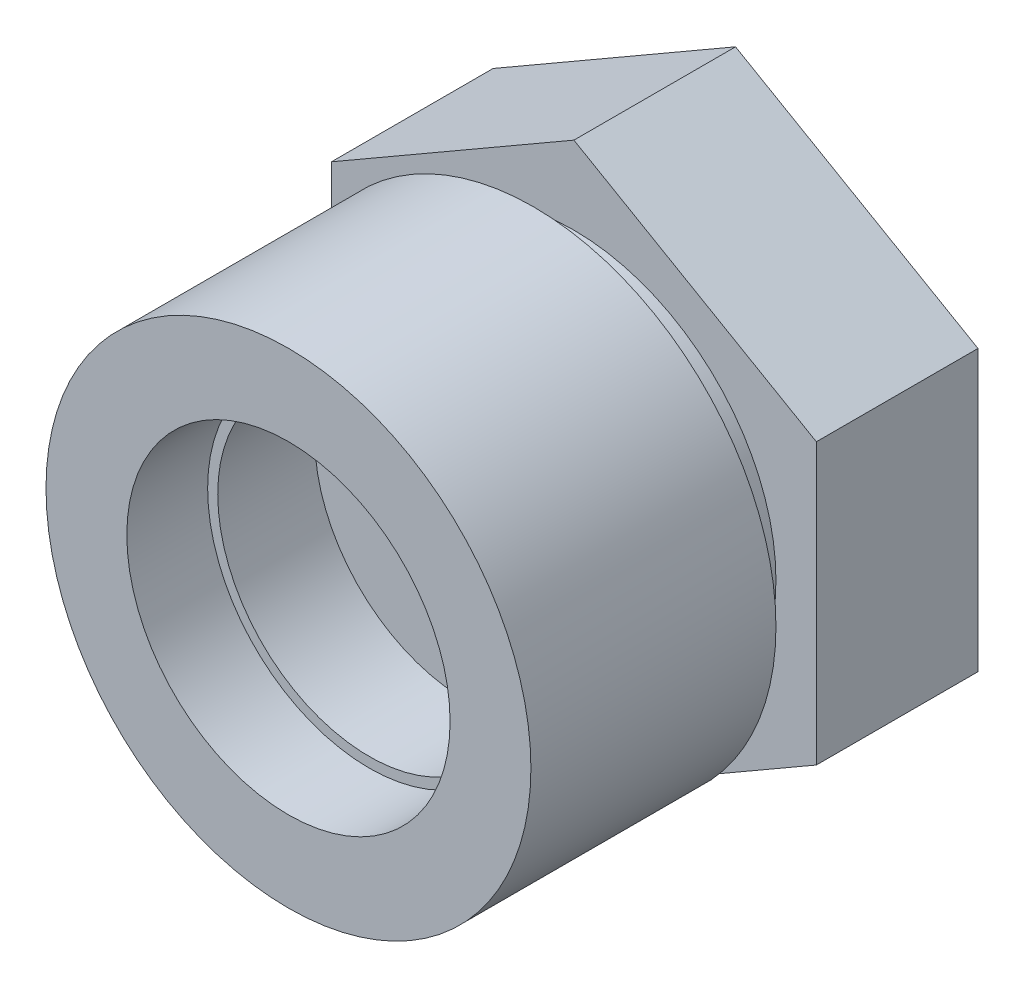
ISO-10303-21;
HEADER;
FILE_DESCRIPTION(('STEP AP214'),'2;1');
FILE_NAME('part.step','',(''),(''),'','','');
FILE_SCHEMA(('AUTOMOTIVE_DESIGN { 1 0 10303 214 1 1 1 1 }'));
ENDSEC;
DATA;
#1=APPLICATION_CONTEXT('core data for automotive mechanical design processes');
#2=APPLICATION_PROTOCOL_DEFINITION('international standard','automotive_design',2000,#1);
#3=PRODUCT_CONTEXT('',#1,'mechanical');
#4=PRODUCT('Part','Part','',(#3));
#5=PRODUCT_RELATED_PRODUCT_CATEGORY('part','',(#4));
#6=PRODUCT_DEFINITION_FORMATION('','',#4);
#7=PRODUCT_DEFINITION_CONTEXT('part definition',#1,'design');
#8=PRODUCT_DEFINITION('design','',#6,#7);
#9=PRODUCT_DEFINITION_SHAPE('','',#8);
#10=(LENGTH_UNIT() NAMED_UNIT(*) SI_UNIT(.MILLI.,.METRE.));
#11=(NAMED_UNIT(*) PLANE_ANGLE_UNIT() SI_UNIT($,.RADIAN.));
#12=(NAMED_UNIT(*) SI_UNIT($,.STERADIAN.) SOLID_ANGLE_UNIT());
#13=UNCERTAINTY_MEASURE_WITH_UNIT(LENGTH_MEASURE(1.E-05),#10,'distance_accuracy_value','');
#14=(GEOMETRIC_REPRESENTATION_CONTEXT(3) GLOBAL_UNCERTAINTY_ASSIGNED_CONTEXT((#13)) GLOBAL_UNIT_ASSIGNED_CONTEXT((#10,
#11,#12)) REPRESENTATION_CONTEXT('',''));
#15=CARTESIAN_POINT('',(0.,0.,0.));
#16=DIRECTION('',(0.,0.,1.));
#17=DIRECTION('',(1.,0.,0.));
#18=AXIS2_PLACEMENT_3D('',#15,#16,#17);
#19=CARTESIAN_POINT('',(0.,0.,0.));
#20=DIRECTION('',(0.,0.,1.));
#21=DIRECTION('',(1.,0.,0.));
#22=AXIS2_PLACEMENT_3D('',#19,#20,#21);
#23=PLANE('',#22);
#24=CARTESIAN_POINT('',(0.,0.,0.));
#25=DIRECTION('',(0.,0.,-1.));
#26=DIRECTION('',(-1.,0.,0.));
#27=AXIS2_PLACEMENT_3D('',#24,#25,#26);
#28=CIRCLE('',#27,7.9375);
#29=CARTESIAN_POINT('',(-7.9375,0.,0.));
#30=VERTEX_POINT('',#29);
#31=EDGE_CURVE('P0_E27',#30,#30,#28,.F.);
#32=ORIENTED_EDGE('',*,*,#31,.F.);
#33=EDGE_LOOP('',(#32));
#34=FACE_BOUND('',#33,.T.);
#35=CARTESIAN_POINT('',(0.,0.,0.));
#36=DIRECTION('',(0.,0.,-1.));
#37=DIRECTION('',(-1.,0.,0.));
#38=AXIS2_PLACEMENT_3D('',#35,#36,#37);
#39=CIRCLE('',#38,2.01929999999999);
#40=CARTESIAN_POINT('',(-2.01929999999999,0.,0.));
#41=VERTEX_POINT('',#40);
#42=EDGE_CURVE('P0_E18',#41,#41,#39,.F.);
#43=ORIENTED_EDGE('',*,*,#42,.T.);
#44=EDGE_LOOP('',(#43));
#45=FACE_BOUND('',#44,.T.);
#46=ADVANCED_FACE('P0_F15',(#34,#45),#23,.F.);
#47=CARTESIAN_POINT('',(0.,0.,-6.35));
#48=DIRECTION('',(0.,0.,-1.));
#49=DIRECTION('',(-1.,0.,0.));
#50=AXIS2_PLACEMENT_3D('',#47,#48,#49);
#51=CYLINDRICAL_SURFACE('',#50,2.01929999999999);
#52=CARTESIAN_POINT('',(0.,0.,1.5875));
#53=DIRECTION('',(0.,0.,-1.));
#54=DIRECTION('',(-1.,0.,0.));
#55=AXIS2_PLACEMENT_3D('',#52,#53,#54);
#56=CIRCLE('',#55,2.01929999999999);
#57=CARTESIAN_POINT('',(-2.01929999999999,0.,1.5875));
#58=VERTEX_POINT('',#57);
#59=EDGE_CURVE('P0_E22',#58,#58,#56,.T.);
#60=ORIENTED_EDGE('',*,*,#59,.F.);
#61=EDGE_LOOP('',(#60));
#62=FACE_BOUND('',#61,.T.);
#63=ORIENTED_EDGE('',*,*,#42,.F.);
#64=EDGE_LOOP('',(#63));
#65=FACE_BOUND('',#64,.T.);
#66=ADVANCED_FACE('P0_F36',(#62,#65),#51,.F.);
#67=CARTESIAN_POINT('',(0.,0.,1.5875));
#68=DIRECTION('',(0.,0.,-1.));
#69=DIRECTION('',(-1.,0.,0.));
#70=AXIS2_PLACEMENT_3D('',#67,#68,#69);
#71=CYLINDRICAL_SURFACE('',#70,7.9375);
#72=ORIENTED_EDGE('',*,*,#31,.T.);
#73=EDGE_LOOP('',(#72));
#74=FACE_BOUND('',#73,.T.);
#75=CARTESIAN_POINT('',(0.,0.,1.5875));
#76=DIRECTION('',(0.,0.,-1.));
#77=DIRECTION('',(-1.,0.,0.));
#78=AXIS2_PLACEMENT_3D('',#75,#76,#77);
#79=CIRCLE('',#78,7.9375);
#80=CARTESIAN_POINT('',(-7.9375,0.,1.5875));
#81=VERTEX_POINT('',#80);
#82=EDGE_CURVE('P0_E10',#81,#81,#79,.F.);
#83=ORIENTED_EDGE('',*,*,#82,.F.);
#84=EDGE_LOOP('',(#83));
#85=FACE_BOUND('',#84,.T.);
#86=ADVANCED_FACE('P0_F38',(#74,#85),#71,.T.);
#87=CARTESIAN_POINT('',(0.,0.,1.5875));
#88=DIRECTION('',(0.,0.,1.));
#89=DIRECTION('',(1.,0.,0.));
#90=AXIS2_PLACEMENT_3D('',#87,#88,#89);
#91=PLANE('',#90);
#92=ORIENTED_EDGE('',*,*,#82,.T.);
#93=EDGE_LOOP('',(#92));
#94=FACE_BOUND('',#93,.T.);
#95=ORIENTED_EDGE('',*,*,#59,.T.);
#96=EDGE_LOOP('',(#95));
#97=FACE_BOUND('',#96,.T.);
#98=ADVANCED_FACE('P0_F45',(#94,#97),#91,.T.);
#99=CLOSED_SHELL('',(#46,#66,#86,#98));
#100=MANIFOLD_SOLID_BREP('P0_B1',#99);
#101=CARTESIAN_POINT('',(0.,0.,0.));
#102=DIRECTION('',(0.,0.,1.));
#103=DIRECTION('',(1.,0.,0.));
#104=AXIS2_PLACEMENT_3D('',#101,#102,#103);
#105=PLANE('',#104);
#106=DIRECTION('',(-0.866025403784435,-0.500000000000007,0.));
#107=VECTOR('',#106,1.);
#108=CARTESIAN_POINT('',(0.,10.9985226280624,0.));
#109=LINE('',#108,#107);
#110=CARTESIAN_POINT('',(-9.52500000000006,5.4992613140311,0.));
#111=VERTEX_POINT('',#110);
#112=CARTESIAN_POINT('',(0.,10.9985226280624,0.));
#113=VERTEX_POINT('',#112);
#114=EDGE_CURVE('P1_E115',#111,#113,#109,.F.);
#115=ORIENTED_EDGE('',*,*,#114,.F.);
#116=DIRECTION('',(0.,-1.,0.));
#117=VECTOR('',#116,1.);
#118=CARTESIAN_POINT('',(-9.52500000000006,5.4992613140311,0.));
#119=LINE('',#118,#117);
#120=CARTESIAN_POINT('',(-9.525,-5.49926131403127,0.));
#121=VERTEX_POINT('',#120);
#122=EDGE_CURVE('P1_E111',#121,#111,#119,.F.);
#123=ORIENTED_EDGE('',*,*,#122,.F.);
#124=DIRECTION('',(0.866025403784441,-0.499999999999995,0.));
#125=VECTOR('',#124,1.);
#126=CARTESIAN_POINT('',(-9.52499999999994,-5.4992613140313,0.));
#127=LINE('',#126,#125);
#128=CARTESIAN_POINT('',(0.,-10.9985226280624,0.));
#129=VERTEX_POINT('',#128);
#130=EDGE_CURVE('P1_E86',#129,#121,#127,.F.);
#131=ORIENTED_EDGE('',*,*,#130,.F.);
#132=DIRECTION('',(0.866025403784438,0.500000000000001,0.));
#133=VECTOR('',#132,1.);
#134=CARTESIAN_POINT('',(0.,-10.9985226280624,0.));
#135=LINE('',#134,#133);
#136=CARTESIAN_POINT('',(9.52500000000002,-5.49926131403117,0.));
#137=VERTEX_POINT('',#136);
#138=EDGE_CURVE('P1_E80',#137,#129,#135,.F.);
#139=ORIENTED_EDGE('',*,*,#138,.F.);
#140=DIRECTION('',(0.,1.,0.));
#141=VECTOR('',#140,1.);
#142=CARTESIAN_POINT('',(9.52500000000002,-5.49926131403117,0.));
#143=LINE('',#142,#141);
#144=CARTESIAN_POINT('',(9.525,5.49926131403122,0.));
#145=VERTEX_POINT('',#144);
#146=EDGE_CURVE('P1_E71',#145,#137,#143,.F.);
#147=ORIENTED_EDGE('',*,*,#146,.F.);
#148=DIRECTION('',(-0.866025403784441,0.499999999999995,0.));
#149=VECTOR('',#148,1.);
#150=CARTESIAN_POINT('',(9.52499999999998,5.49926131403123,0.));
#151=LINE('',#150,#149);
#152=EDGE_CURVE('P1_E66',#113,#145,#151,.F.);
#153=ORIENTED_EDGE('',*,*,#152,.F.);
#154=EDGE_LOOP('',(#115,#123,#131,#139,#147,#153));
#155=FACE_BOUND('',#154,.T.);
#156=CARTESIAN_POINT('',(0.,0.,0.));
#157=DIRECTION('',(0.,0.,-1.));
#158=DIRECTION('',(-1.,0.,0.));
#159=AXIS2_PLACEMENT_3D('',#156,#157,#158);
#160=CIRCLE('',#159,2.01929999999999);
#161=CARTESIAN_POINT('',(-2.01929999999999,0.,0.));
#162=VERTEX_POINT('',#161);
#163=EDGE_CURVE('P1_E20',#162,#162,#160,.T.);
#164=ORIENTED_EDGE('',*,*,#163,.T.);
#165=EDGE_LOOP('',(#164));
#166=FACE_BOUND('',#165,.T.);
#167=ADVANCED_FACE('P1_F17',(#155,#166),#105,.T.);
#168=CARTESIAN_POINT('',(0.,0.,-6.35));
#169=DIRECTION('',(0.,0.,-1.));
#170=DIRECTION('',(-1.,0.,0.));
#171=AXIS2_PLACEMENT_3D('',#168,#169,#170);
#172=CYLINDRICAL_SURFACE('',#171,2.01929999999999);
#173=ORIENTED_EDGE('',*,*,#163,.F.);
#174=EDGE_LOOP('',(#173));
#175=FACE_BOUND('',#174,.T.);
#176=CARTESIAN_POINT('',(0.,0.,-6.35));
#177=DIRECTION('',(0.,0.,-1.));
#178=DIRECTION('',(-1.,0.,0.));
#179=AXIS2_PLACEMENT_3D('',#176,#177,#178);
#180=CIRCLE('',#179,2.01929999999999);
#181=CARTESIAN_POINT('',(-2.01929999999999,0.,-6.35));
#182=VERTEX_POINT('',#181);
#183=EDGE_CURVE('P1_E97',#182,#182,#180,.T.);
#184=ORIENTED_EDGE('',*,*,#183,.T.);
#185=EDGE_LOOP('',(#184));
#186=FACE_BOUND('',#185,.T.);
#187=ADVANCED_FACE('P1_F190',(#175,#186),#172,.F.);
#188=CARTESIAN_POINT('',(0.,-10.9985226280624,-6.35));
#189=DIRECTION('',(0.500000000000001,-0.866025403784438,0.));
#190=DIRECTION('',(0.866025403784438,0.500000000000001,0.));
#191=AXIS2_PLACEMENT_3D('',#188,#189,#190);
#192=PLANE('',#191);
#193=DIRECTION('',(0.866025403784438,0.500000000000001,0.));
#194=VECTOR('',#193,1.);
#195=CARTESIAN_POINT('',(0.,-10.9985226280624,-6.35));
#196=LINE('',#195,#194);
#197=CARTESIAN_POINT('',(0.,-10.9985226280624,-6.35));
#198=VERTEX_POINT('',#197);
#199=CARTESIAN_POINT('',(9.52500000000002,-5.49926131403117,-6.35));
#200=VERTEX_POINT('',#199);
#201=EDGE_CURVE('P1_E93',#198,#200,#196,.T.);
#202=ORIENTED_EDGE('',*,*,#201,.T.);
#203=DIRECTION('',(0.,0.,1.));
#204=VECTOR('',#203,1.);
#205=CARTESIAN_POINT('',(9.52500000000002,-5.49926131403117,-6.35));
#206=LINE('',#205,#204);
#207=EDGE_CURVE('P1_E76',#137,#200,#206,.F.);
#208=ORIENTED_EDGE('',*,*,#207,.F.);
#209=ORIENTED_EDGE('',*,*,#138,.T.);
#210=DIRECTION('',(0.,0.,1.));
#211=VECTOR('',#210,1.);
#212=CARTESIAN_POINT('',(0.,-10.9985226280624,-6.35));
#213=LINE('',#212,#211);
#214=EDGE_CURVE('P1_E99',#198,#129,#213,.T.);
#215=ORIENTED_EDGE('',*,*,#214,.F.);
#216=EDGE_LOOP('',(#202,#208,#209,#215));
#217=FACE_BOUND('',#216,.T.);
#218=ADVANCED_FACE('P1_F92',(#217),#192,.T.);
#219=CARTESIAN_POINT('',(9.52500000000002,-5.49926131403117,-6.35));
#220=DIRECTION('',(1.,0.,0.));
#221=DIRECTION('',(0.,1.,0.));
#222=AXIS2_PLACEMENT_3D('',#219,#220,#221);
#223=PLANE('',#222);
#224=DIRECTION('',(0.,1.,0.));
#225=VECTOR('',#224,1.);
#226=CARTESIAN_POINT('',(9.52500000000002,0.,-6.35));
#227=LINE('',#226,#225);
#228=CARTESIAN_POINT('',(9.52499999999999,5.49926131403123,-6.35));
#229=VERTEX_POINT('',#228);
#230=EDGE_CURVE('P1_E102',#200,#229,#227,.T.);
#231=ORIENTED_EDGE('',*,*,#230,.T.);
#232=DIRECTION('',(0.,0.,1.));
#233=VECTOR('',#232,1.);
#234=CARTESIAN_POINT('',(9.52499999999998,5.49926131403123,-6.35));
#235=LINE('',#234,#233);
#236=EDGE_CURVE('P1_E78',#145,#229,#235,.F.);
#237=ORIENTED_EDGE('',*,*,#236,.F.);
#238=ORIENTED_EDGE('',*,*,#146,.T.);
#239=ORIENTED_EDGE('',*,*,#207,.T.);
#240=EDGE_LOOP('',(#231,#237,#238,#239));
#241=FACE_BOUND('',#240,.T.);
#242=ADVANCED_FACE('P1_F74',(#241),#223,.T.);
#243=CARTESIAN_POINT('',(9.52499999999998,5.49926131403123,-6.35));
#244=DIRECTION('',(0.499999999999995,0.866025403784441,0.));
#245=DIRECTION('',(-0.866025403784441,0.499999999999995,0.));
#246=AXIS2_PLACEMENT_3D('',#243,#244,#245);
#247=PLANE('',#246);
#248=DIRECTION('',(-0.866025403784441,0.499999999999995,0.));
#249=VECTOR('',#248,1.);
#250=CARTESIAN_POINT('',(9.52499999999998,5.49926131403123,-6.35));
#251=LINE('',#250,#249);
#252=CARTESIAN_POINT('',(0.,10.9985226280624,-6.35));
#253=VERTEX_POINT('',#252);
#254=EDGE_CURVE('P1_E119',#229,#253,#251,.T.);
#255=ORIENTED_EDGE('',*,*,#254,.T.);
#256=DIRECTION('',(0.,0.,1.));
#257=VECTOR('',#256,1.);
#258=CARTESIAN_POINT('',(0.,10.9985226280624,-6.35));
#259=LINE('',#258,#257);
#260=EDGE_CURVE('P1_E113',#113,#253,#259,.F.);
#261=ORIENTED_EDGE('',*,*,#260,.F.);
#262=ORIENTED_EDGE('',*,*,#152,.T.);
#263=ORIENTED_EDGE('',*,*,#236,.T.);
#264=EDGE_LOOP('',(#255,#261,#262,#263));
#265=FACE_BOUND('',#264,.T.);
#266=ADVANCED_FACE('P1_F118',(#265),#247,.T.);
#267=CARTESIAN_POINT('',(0.,10.9985226280624,-6.35));
#268=DIRECTION('',(-0.500000000000007,0.866025403784435,0.));
#269=DIRECTION('',(-0.866025403784435,-0.500000000000007,0.));
#270=AXIS2_PLACEMENT_3D('',#267,#268,#269);
#271=PLANE('',#270);
#272=DIRECTION('',(-0.866025403784435,-0.500000000000007,0.));
#273=VECTOR('',#272,1.);
#274=CARTESIAN_POINT('',(0.,10.9985226280624,-6.35));
#275=LINE('',#274,#273);
#276=CARTESIAN_POINT('',(-9.52500000000006,5.4992613140311,-6.35));
#277=VERTEX_POINT('',#276);
#278=EDGE_CURVE('P1_E126',#253,#277,#275,.T.);
#279=ORIENTED_EDGE('',*,*,#278,.T.);
#280=DIRECTION('',(0.,0.,1.));
#281=VECTOR('',#280,1.);
#282=CARTESIAN_POINT('',(-9.52500000000006,5.4992613140311,-6.35));
#283=LINE('',#282,#281);
#284=EDGE_CURVE('P1_E109',#111,#277,#283,.F.);
#285=ORIENTED_EDGE('',*,*,#284,.F.);
#286=ORIENTED_EDGE('',*,*,#114,.T.);
#287=ORIENTED_EDGE('',*,*,#260,.T.);
#288=EDGE_LOOP('',(#279,#285,#286,#287));
#289=FACE_BOUND('',#288,.T.);
#290=ADVANCED_FACE('P1_F135',(#289),#271,.T.);
#291=CARTESIAN_POINT('',(-9.52500000000006,5.4992613140311,-6.35));
#292=DIRECTION('',(-1.,0.,0.));
#293=DIRECTION('',(0.,-1.,0.));
#294=AXIS2_PLACEMENT_3D('',#291,#292,#293);
#295=PLANE('',#294);
#296=DIRECTION('',(0.,1.,0.));
#297=VECTOR('',#296,1.);
#298=CARTESIAN_POINT('',(-9.52500000000006,0.,-6.35));
#299=LINE('',#298,#297);
#300=CARTESIAN_POINT('',(-9.52499999999997,-5.49926131403128,-6.35));
#301=VERTEX_POINT('',#300);
#302=EDGE_CURVE('P1_E26',#277,#301,#299,.F.);
#303=ORIENTED_EDGE('',*,*,#302,.T.);
#304=DIRECTION('',(0.,0.,1.));
#305=VECTOR('',#304,1.);
#306=CARTESIAN_POINT('',(-9.52499999999994,-5.4992613140313,-6.35));
#307=LINE('',#306,#305);
#308=EDGE_CURVE('P1_E34',#121,#301,#307,.F.);
#309=ORIENTED_EDGE('',*,*,#308,.F.);
#310=ORIENTED_EDGE('',*,*,#122,.T.);
#311=ORIENTED_EDGE('',*,*,#284,.T.);
#312=EDGE_LOOP('',(#303,#309,#310,#311));
#313=FACE_BOUND('',#312,.T.);
#314=ADVANCED_FACE('P1_F132',(#313),#295,.T.);
#315=CARTESIAN_POINT('',(-9.52499999999994,-5.4992613140313,-6.35));
#316=DIRECTION('',(-0.499999999999995,-0.866025403784441,0.));
#317=DIRECTION('',(0.866025403784441,-0.499999999999995,0.));
#318=AXIS2_PLACEMENT_3D('',#315,#316,#317);
#319=PLANE('',#318);
#320=DIRECTION('',(0.866025403784441,-0.499999999999995,0.));
#321=VECTOR('',#320,1.);
#322=CARTESIAN_POINT('',(-9.52499999999994,-5.4992613140313,-6.35));
#323=LINE('',#322,#321);
#324=EDGE_CURVE('P1_E11',#301,#198,#323,.T.);
#325=ORIENTED_EDGE('',*,*,#324,.T.);
#326=ORIENTED_EDGE('',*,*,#214,.T.);
#327=ORIENTED_EDGE('',*,*,#130,.T.);
#328=ORIENTED_EDGE('',*,*,#308,.T.);
#329=EDGE_LOOP('',(#325,#326,#327,#328));
#330=FACE_BOUND('',#329,.T.);
#331=ADVANCED_FACE('P1_F143',(#330),#319,.T.);
#332=CARTESIAN_POINT('',(0.,0.,-6.35));
#333=DIRECTION('',(0.,0.,1.));
#334=DIRECTION('',(1.,0.,0.));
#335=AXIS2_PLACEMENT_3D('',#332,#333,#334);
#336=PLANE('',#335);
#337=ORIENTED_EDGE('',*,*,#302,.F.);
#338=ORIENTED_EDGE('',*,*,#278,.F.);
#339=ORIENTED_EDGE('',*,*,#254,.F.);
#340=ORIENTED_EDGE('',*,*,#230,.F.);
#341=ORIENTED_EDGE('',*,*,#201,.F.);
#342=ORIENTED_EDGE('',*,*,#324,.F.);
#343=EDGE_LOOP('',(#337,#338,#339,#340,#341,#342));
#344=FACE_BOUND('',#343,.T.);
#345=ORIENTED_EDGE('',*,*,#183,.F.);
#346=EDGE_LOOP('',(#345));
#347=FACE_BOUND('',#346,.T.);
#348=ADVANCED_FACE('P1_F123',(#344,#347),#336,.F.);
#349=CLOSED_SHELL('',(#167,#187,#218,#242,#266,#290,#314,#331,#348));
#350=MANIFOLD_SOLID_BREP('P1_B1',#349);
#351=CARTESIAN_POINT('',(0.,0.,4.2291));
#352=DIRECTION('',(0.,0.,1.));
#353=DIRECTION('',(1.,0.,0.));
#354=AXIS2_PLACEMENT_3D('',#351,#352,#353);
#355=CYLINDRICAL_SURFACE('',#354,5.953125);
#356=CARTESIAN_POINT('',(0.,0.,8.0391));
#357=DIRECTION('',(0.,0.,1.));
#358=DIRECTION('',(1.,0.,0.));
#359=AXIS2_PLACEMENT_3D('',#356,#357,#358);
#360=CIRCLE('',#359,5.953125);
#361=CARTESIAN_POINT('',(5.953125,0.,8.0391));
#362=VERTEX_POINT('',#361);
#363=EDGE_CURVE('P2_E18',#362,#362,#360,.F.);
#364=ORIENTED_EDGE('',*,*,#363,.F.);
#365=EDGE_LOOP('',(#364));
#366=FACE_BOUND('',#365,.T.);
#367=CARTESIAN_POINT('',(0.,0.,4.2291));
#368=DIRECTION('',(0.,0.,1.));
#369=DIRECTION('',(1.,0.,0.));
#370=AXIS2_PLACEMENT_3D('',#367,#368,#369);
#371=CIRCLE('',#370,5.953125);
#372=CARTESIAN_POINT('',(5.953125,0.,4.2291));
#373=VERTEX_POINT('',#372);
#374=EDGE_CURVE('P2_E40',#373,#373,#371,.T.);
#375=ORIENTED_EDGE('',*,*,#374,.F.);
#376=EDGE_LOOP('',(#375));
#377=FACE_BOUND('',#376,.T.);
#378=ADVANCED_FACE('P2_F15',(#366,#377),#355,.F.);
#379=CARTESIAN_POINT('',(0.,0.,8.0391));
#380=DIRECTION('',(0.,0.,1.));
#381=DIRECTION('',(1.,0.,0.));
#382=AXIS2_PLACEMENT_3D('',#379,#380,#381);
#383=PLANE('',#382);
#384=CARTESIAN_POINT('',(0.,0.,8.0391));
#385=DIRECTION('',(0.,0.,1.));
#386=DIRECTION('',(1.,0.,0.));
#387=AXIS2_PLACEMENT_3D('',#384,#385,#386);
#388=CIRCLE('',#387,6.35);
#389=CARTESIAN_POINT('',(6.35,0.,8.0391));
#390=VERTEX_POINT('',#389);
#391=EDGE_CURVE('P2_E38',#390,#390,#388,.T.);
#392=ORIENTED_EDGE('',*,*,#391,.T.);
#393=EDGE_LOOP('',(#392));
#394=FACE_BOUND('',#393,.T.);
#395=ORIENTED_EDGE('',*,*,#363,.T.);
#396=EDGE_LOOP('',(#395));
#397=FACE_BOUND('',#396,.T.);
#398=ADVANCED_FACE('P2_F47',(#394,#397),#383,.T.);
#399=CARTESIAN_POINT('',(0.,0.,4.2291));
#400=DIRECTION('',(0.,0.,1.));
#401=DIRECTION('',(1.,0.,0.));
#402=AXIS2_PLACEMENT_3D('',#399,#400,#401);
#403=PLANE('',#402);
#404=CARTESIAN_POINT('',(0.,0.,4.2291));
#405=DIRECTION('',(0.,0.,-1.));
#406=DIRECTION('',(-1.,0.,0.));
#407=AXIS2_PLACEMENT_3D('',#404,#405,#406);
#408=CIRCLE('',#407,2.01929999999999);
#409=CARTESIAN_POINT('',(-2.01929999999999,0.,4.2291));
#410=VERTEX_POINT('',#409);
#411=EDGE_CURVE('P2_E35',#410,#410,#408,.T.);
#412=ORIENTED_EDGE('',*,*,#411,.T.);
#413=EDGE_LOOP('',(#412));
#414=FACE_BOUND('',#413,.T.);
#415=ORIENTED_EDGE('',*,*,#374,.T.);
#416=EDGE_LOOP('',(#415));
#417=FACE_BOUND('',#416,.T.);
#418=ADVANCED_FACE('P2_F55',(#414,#417),#403,.T.);
#419=CARTESIAN_POINT('',(0.,0.,8.0391));
#420=DIRECTION('',(0.,0.,1.));
#421=DIRECTION('',(1.,0.,0.));
#422=AXIS2_PLACEMENT_3D('',#419,#420,#421);
#423=CYLINDRICAL_SURFACE('',#422,6.35);
#424=CARTESIAN_POINT('',(0.,0.,11.2141));
#425=DIRECTION('',(0.,0.,1.));
#426=DIRECTION('',(1.,0.,0.));
#427=AXIS2_PLACEMENT_3D('',#424,#425,#426);
#428=CIRCLE('',#427,6.35);
#429=CARTESIAN_POINT('',(6.35,0.,11.2141));
#430=VERTEX_POINT('',#429);
#431=EDGE_CURVE('P2_E32',#430,#430,#428,.F.);
#432=ORIENTED_EDGE('',*,*,#431,.F.);
#433=EDGE_LOOP('',(#432));
#434=FACE_BOUND('',#433,.T.);
#435=ORIENTED_EDGE('',*,*,#391,.F.);
#436=EDGE_LOOP('',(#435));
#437=FACE_BOUND('',#436,.T.);
#438=ADVANCED_FACE('P2_F75',(#434,#437),#423,.F.);
#439=CARTESIAN_POINT('',(0.,0.,-6.35));
#440=DIRECTION('',(0.,0.,-1.));
#441=DIRECTION('',(-1.,0.,0.));
#442=AXIS2_PLACEMENT_3D('',#439,#440,#441);
#443=CYLINDRICAL_SURFACE('',#442,2.01929999999999);
#444=CARTESIAN_POINT('',(0.,0.,1.5875));
#445=DIRECTION('',(0.,0.,-1.));
#446=DIRECTION('',(-1.,0.,0.));
#447=AXIS2_PLACEMENT_3D('',#444,#445,#446);
#448=CIRCLE('',#447,2.01929999999999);
#449=CARTESIAN_POINT('',(-2.01929999999999,0.,1.5875));
#450=VERTEX_POINT('',#449);
#451=EDGE_CURVE('P2_E27',#450,#450,#448,.T.);
#452=ORIENTED_EDGE('',*,*,#451,.T.);
#453=EDGE_LOOP('',(#452));
#454=FACE_BOUND('',#453,.T.);
#455=ORIENTED_EDGE('',*,*,#411,.F.);
#456=EDGE_LOOP('',(#455));
#457=FACE_BOUND('',#456,.T.);
#458=ADVANCED_FACE('P2_F71',(#454,#457),#443,.F.);
#459=CARTESIAN_POINT('',(0.,0.,11.2141));
#460=DIRECTION('',(0.,0.,1.));
#461=DIRECTION('',(1.,0.,0.));
#462=AXIS2_PLACEMENT_3D('',#459,#460,#461);
#463=PLANE('',#462);
#464=CARTESIAN_POINT('',(0.,0.,11.2141));
#465=DIRECTION('',(0.,0.,-1.));
#466=DIRECTION('',(-1.,0.,0.));
#467=AXIS2_PLACEMENT_3D('',#464,#465,#466);
#468=CIRCLE('',#467,9.525);
#469=CARTESIAN_POINT('',(-9.525,0.,11.2141));
#470=VERTEX_POINT('',#469);
#471=EDGE_CURVE('P2_E22',#470,#470,#468,.T.);
#472=ORIENTED_EDGE('',*,*,#471,.F.);
#473=EDGE_LOOP('',(#472));
#474=FACE_BOUND('',#473,.T.);
#475=ORIENTED_EDGE('',*,*,#431,.T.);
#476=EDGE_LOOP('',(#475));
#477=FACE_BOUND('',#476,.T.);
#478=ADVANCED_FACE('P2_F64',(#474,#477),#463,.T.);
#479=CARTESIAN_POINT('',(0.,0.,1.5875));
#480=DIRECTION('',(0.,0.,1.));
#481=DIRECTION('',(1.,0.,0.));
#482=AXIS2_PLACEMENT_3D('',#479,#480,#481);
#483=PLANE('',#482);
#484=CARTESIAN_POINT('',(0.,0.,1.5875));
#485=DIRECTION('',(0.,0.,-1.));
#486=DIRECTION('',(-1.,0.,0.));
#487=AXIS2_PLACEMENT_3D('',#484,#485,#486);
#488=CIRCLE('',#487,9.525);
#489=CARTESIAN_POINT('',(-9.525,0.,1.5875));
#490=VERTEX_POINT('',#489);
#491=EDGE_CURVE('P2_E10',#490,#490,#488,.F.);
#492=ORIENTED_EDGE('',*,*,#491,.F.);
#493=EDGE_LOOP('',(#492));
#494=FACE_BOUND('',#493,.T.);
#495=ORIENTED_EDGE('',*,*,#451,.F.);
#496=EDGE_LOOP('',(#495));
#497=FACE_BOUND('',#496,.T.);
#498=ADVANCED_FACE('P2_F59',(#494,#497),#483,.F.);
#499=CARTESIAN_POINT('',(0.,0.,11.2141));
#500=DIRECTION('',(0.,0.,-1.));
#501=DIRECTION('',(-1.,0.,0.));
#502=AXIS2_PLACEMENT_3D('',#499,#500,#501);
#503=CYLINDRICAL_SURFACE('',#502,9.525);
#504=ORIENTED_EDGE('',*,*,#491,.T.);
#505=EDGE_LOOP('',(#504));
#506=FACE_BOUND('',#505,.T.);
#507=ORIENTED_EDGE('',*,*,#471,.T.);
#508=EDGE_LOOP('',(#507));
#509=FACE_BOUND('',#508,.T.);
#510=ADVANCED_FACE('P2_F57',(#506,#509),#503,.T.);
#511=CLOSED_SHELL('',(#378,#398,#418,#438,#458,#478,#498,#510));
#512=MANIFOLD_SOLID_BREP('P2_B1',#511);
#513=ADVANCED_BREP_SHAPE_REPRESENTATION('',(#18,#100,#350,#512),#14);
#514=SHAPE_DEFINITION_REPRESENTATION(#9,#513);
ENDSEC;
END-ISO-10303-21;
